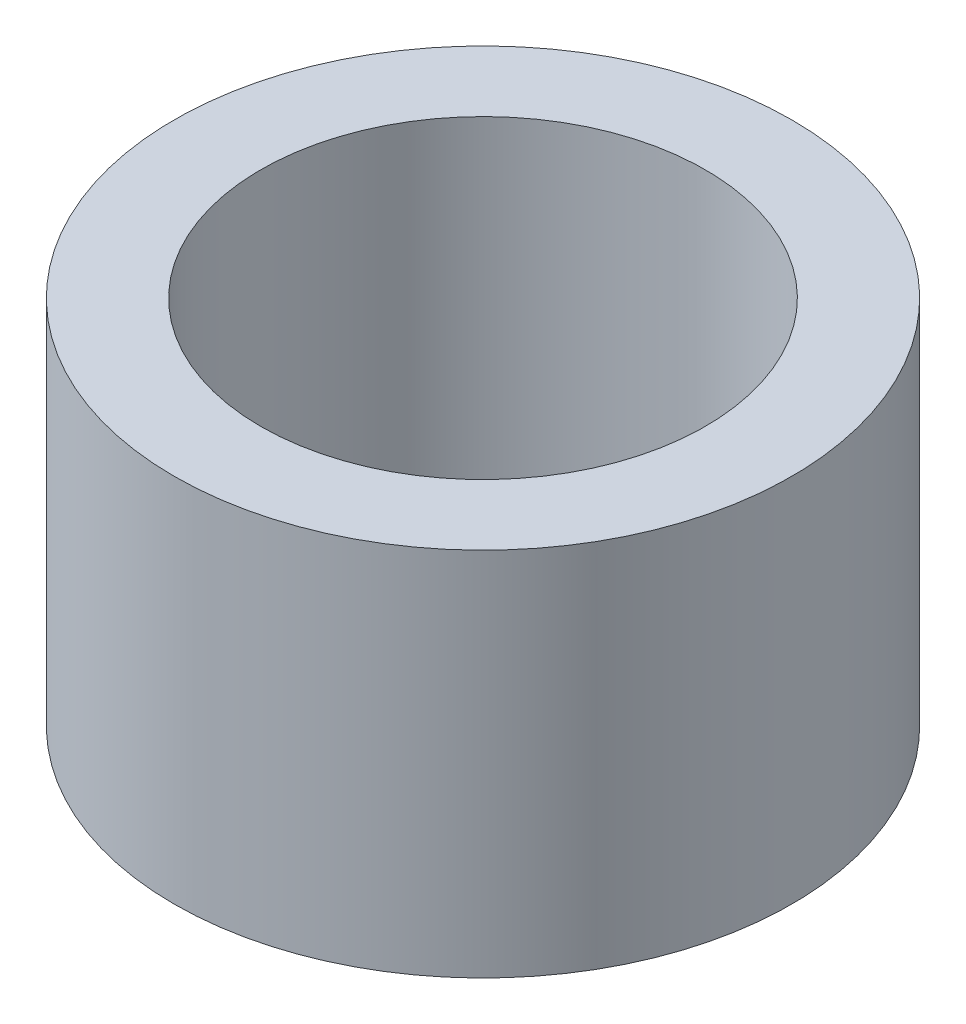
ISO-10303-21;
HEADER;
FILE_DESCRIPTION(('STEP AP214'),'2;1');
FILE_NAME('part.step','',(''),(''),'','','');
FILE_SCHEMA(('AUTOMOTIVE_DESIGN { 1 0 10303 214 1 1 1 1 }'));
ENDSEC;
DATA;
#1=APPLICATION_CONTEXT('core data for automotive mechanical design processes');
#2=APPLICATION_PROTOCOL_DEFINITION('international standard','automotive_design',2000,#1);
#3=PRODUCT_CONTEXT('',#1,'mechanical');
#4=PRODUCT('Part','Part','',(#3));
#5=PRODUCT_RELATED_PRODUCT_CATEGORY('part','',(#4));
#6=PRODUCT_DEFINITION_FORMATION('','',#4);
#7=PRODUCT_DEFINITION_CONTEXT('part definition',#1,'design');
#8=PRODUCT_DEFINITION('design','',#6,#7);
#9=PRODUCT_DEFINITION_SHAPE('','',#8);
#10=(LENGTH_UNIT() NAMED_UNIT(*) SI_UNIT(.MILLI.,.METRE.));
#11=(NAMED_UNIT(*) PLANE_ANGLE_UNIT() SI_UNIT($,.RADIAN.));
#12=(NAMED_UNIT(*) SI_UNIT($,.STERADIAN.) SOLID_ANGLE_UNIT());
#13=UNCERTAINTY_MEASURE_WITH_UNIT(LENGTH_MEASURE(1.E-05),#10,'distance_accuracy_value','');
#14=(GEOMETRIC_REPRESENTATION_CONTEXT(3) GLOBAL_UNCERTAINTY_ASSIGNED_CONTEXT((#13)) GLOBAL_UNIT_ASSIGNED_CONTEXT((#10,
#11,#12)) REPRESENTATION_CONTEXT('',''));
#15=CARTESIAN_POINT('',(0.,0.,0.));
#16=DIRECTION('',(0.,0.,1.));
#17=DIRECTION('',(1.,0.,0.));
#18=AXIS2_PLACEMENT_3D('',#15,#16,#17);
#19=CARTESIAN_POINT('',(0.,3.,0.));
#20=DIRECTION('',(0.,1.,0.));
#21=DIRECTION('',(0.,0.,1.));
#22=AXIS2_PLACEMENT_3D('',#19,#20,#21);
#23=PLANE('',#22);
#24=CARTESIAN_POINT('',(0.,3.,0.));
#25=DIRECTION('',(0.,1.,0.));
#26=DIRECTION('',(0.,0.,1.));
#27=AXIS2_PLACEMENT_3D('',#24,#25,#26);
#28=CIRCLE('',#27,2.5);
#29=CARTESIAN_POINT('',(0.,3.,2.5));
#30=VERTEX_POINT('',#29);
#31=EDGE_CURVE('E10',#30,#30,#28,.T.);
#32=ORIENTED_EDGE('',*,*,#31,.T.);
#33=EDGE_LOOP('',(#32));
#34=FACE_BOUND('',#33,.T.);
#35=CARTESIAN_POINT('',(0.,3.,0.));
#36=DIRECTION('',(0.,1.,0.));
#37=DIRECTION('',(0.,0.,1.));
#38=AXIS2_PLACEMENT_3D('',#35,#36,#37);
#39=CIRCLE('',#38,1.8);
#40=CARTESIAN_POINT('',(0.,3.,1.8));
#41=VERTEX_POINT('',#40);
#42=EDGE_CURVE('E50',#41,#41,#39,.T.);
#43=ORIENTED_EDGE('',*,*,#42,.F.);
#44=EDGE_LOOP('',(#43));
#45=FACE_BOUND('',#44,.T.);
#46=ADVANCED_FACE('F37',(#34,#45),#23,.T.);
#47=CARTESIAN_POINT('',(0.,0.,0.));
#48=DIRECTION('',(0.,1.,0.));
#49=DIRECTION('',(0.,0.,1.));
#50=AXIS2_PLACEMENT_3D('',#47,#48,#49);
#51=PLANE('',#50);
#52=CARTESIAN_POINT('',(0.,0.,0.));
#53=DIRECTION('',(0.,1.,0.));
#54=DIRECTION('',(0.,0.,1.));
#55=AXIS2_PLACEMENT_3D('',#52,#53,#54);
#56=CIRCLE('',#55,2.5);
#57=CARTESIAN_POINT('',(0.,0.,2.5));
#58=VERTEX_POINT('',#57);
#59=EDGE_CURVE('E41',#58,#58,#56,.T.);
#60=ORIENTED_EDGE('',*,*,#59,.F.);
#61=EDGE_LOOP('',(#60));
#62=FACE_BOUND('',#61,.T.);
#63=CARTESIAN_POINT('',(0.,0.,0.));
#64=DIRECTION('',(0.,1.,0.));
#65=DIRECTION('',(0.,0.,1.));
#66=AXIS2_PLACEMENT_3D('',#63,#64,#65);
#67=CIRCLE('',#66,1.8);
#68=CARTESIAN_POINT('',(0.,0.,1.8));
#69=VERTEX_POINT('',#68);
#70=EDGE_CURVE('E52',#69,#69,#67,.T.);
#71=ORIENTED_EDGE('',*,*,#70,.T.);
#72=EDGE_LOOP('',(#71));
#73=FACE_BOUND('',#72,.T.);
#74=ADVANCED_FACE('F64',(#62,#73),#51,.F.);
#75=CARTESIAN_POINT('',(0.,3.,0.));
#76=DIRECTION('',(0.,-1.,0.));
#77=DIRECTION('',(0.,0.,-1.));
#78=AXIS2_PLACEMENT_3D('',#75,#76,#77);
#79=CYLINDRICAL_SURFACE('',#78,2.5);
#80=ORIENTED_EDGE('',*,*,#31,.F.);
#81=EDGE_LOOP('',(#80));
#82=FACE_BOUND('',#81,.T.);
#83=ORIENTED_EDGE('',*,*,#59,.T.);
#84=EDGE_LOOP('',(#83));
#85=FACE_BOUND('',#84,.T.);
#86=ADVANCED_FACE('F39',(#82,#85),#79,.T.);
#87=CARTESIAN_POINT('',(0.,3.,0.));
#88=DIRECTION('',(0.,-1.,0.));
#89=DIRECTION('',(0.,0.,-1.));
#90=AXIS2_PLACEMENT_3D('',#87,#88,#89);
#91=CYLINDRICAL_SURFACE('',#90,1.8);
#92=ORIENTED_EDGE('',*,*,#42,.T.);
#93=EDGE_LOOP('',(#92));
#94=FACE_BOUND('',#93,.T.);
#95=ORIENTED_EDGE('',*,*,#70,.F.);
#96=EDGE_LOOP('',(#95));
#97=FACE_BOUND('',#96,.T.);
#98=ADVANCED_FACE('F60',(#94,#97),#91,.F.);
#99=CLOSED_SHELL('',(#46,#74,#86,#98));
#100=MANIFOLD_SOLID_BREP('B2',#99);
#101=ADVANCED_BREP_SHAPE_REPRESENTATION('',(#18,#100),#14);
#102=SHAPE_DEFINITION_REPRESENTATION(#9,#101);
ENDSEC;
END-ISO-10303-21;
